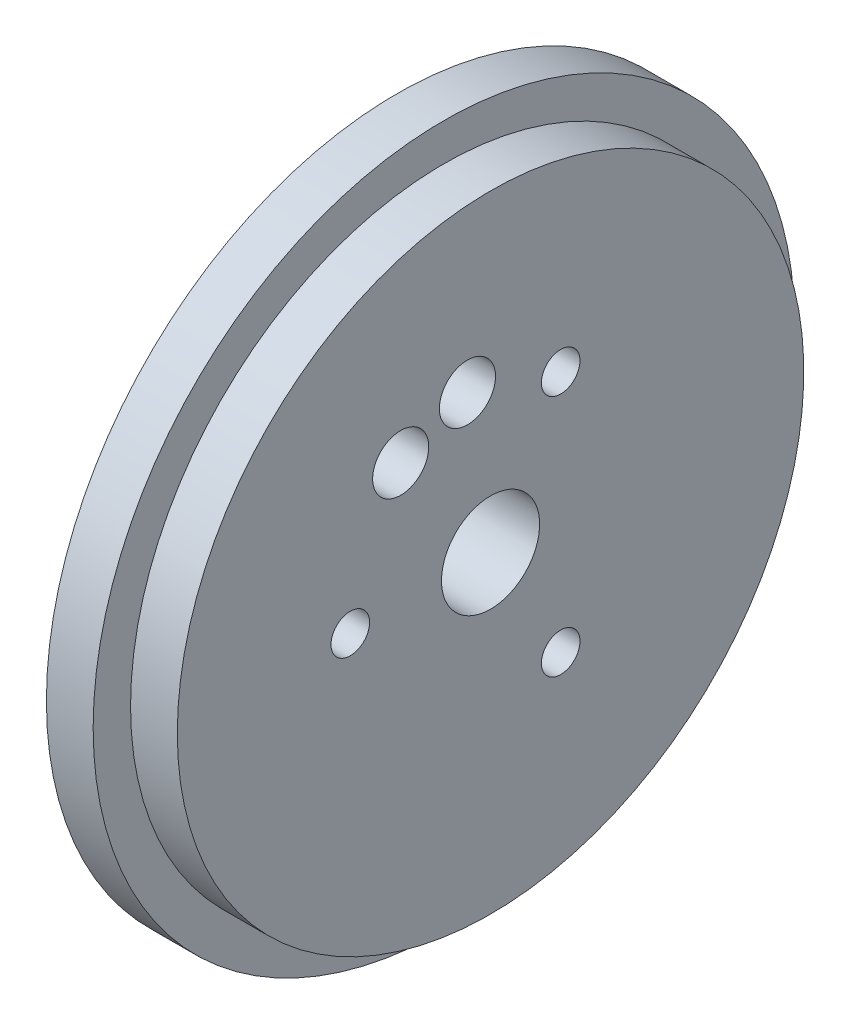
ISO-10303-21;
HEADER;
FILE_DESCRIPTION(('STEP AP214'),'2;1');
FILE_NAME('part.step','',(''),(''),'','','');
FILE_SCHEMA(('AUTOMOTIVE_DESIGN { 1 0 10303 214 1 1 1 1 }'));
ENDSEC;
DATA;
#1=APPLICATION_CONTEXT('core data for automotive mechanical design processes');
#2=APPLICATION_PROTOCOL_DEFINITION('international standard','automotive_design',2000,#1);
#3=PRODUCT_CONTEXT('',#1,'mechanical');
#4=PRODUCT('Part','Part','',(#3));
#5=PRODUCT_RELATED_PRODUCT_CATEGORY('part','',(#4));
#6=PRODUCT_DEFINITION_FORMATION('','',#4);
#7=PRODUCT_DEFINITION_CONTEXT('part definition',#1,'design');
#8=PRODUCT_DEFINITION('design','',#6,#7);
#9=PRODUCT_DEFINITION_SHAPE('','',#8);
#10=(LENGTH_UNIT() NAMED_UNIT(*) SI_UNIT(.MILLI.,.METRE.));
#11=(NAMED_UNIT(*) PLANE_ANGLE_UNIT() SI_UNIT($,.RADIAN.));
#12=(NAMED_UNIT(*) SI_UNIT($,.STERADIAN.) SOLID_ANGLE_UNIT());
#13=UNCERTAINTY_MEASURE_WITH_UNIT(LENGTH_MEASURE(1.E-05),#10,'distance_accuracy_value','');
#14=(GEOMETRIC_REPRESENTATION_CONTEXT(3) GLOBAL_UNCERTAINTY_ASSIGNED_CONTEXT((#13)) GLOBAL_UNIT_ASSIGNED_CONTEXT((#10,
#11,#12)) REPRESENTATION_CONTEXT('',''));
#15=CARTESIAN_POINT('',(0.,0.,0.));
#16=DIRECTION('',(0.,0.,1.));
#17=DIRECTION('',(1.,0.,0.));
#18=AXIS2_PLACEMENT_3D('',#15,#16,#17);
#19=CARTESIAN_POINT('',(135.7,30.,0.));
#20=DIRECTION('',(1.,0.,0.));
#21=DIRECTION('',(0.,0.,-1.));
#22=AXIS2_PLACEMENT_3D('',#19,#20,#21);
#23=PLANE('',#22);
#24=CARTESIAN_POINT('',(135.7,10.3923048454133,-6.00000000000001));
#25=DIRECTION('',(1.,0.,0.));
#26=DIRECTION('',(0.,0.,-1.));
#27=AXIS2_PLACEMENT_3D('',#24,#25,#26);
#28=CIRCLE('',#27,1.65);
#29=CARTESIAN_POINT('',(135.7,10.3923048454133,-7.65000000000001));
#30=VERTEX_POINT('',#29);
#31=EDGE_CURVE('E56',#30,#30,#28,.F.);
#32=ORIENTED_EDGE('',*,*,#31,.F.);
#33=EDGE_LOOP('',(#32));
#34=FACE_BOUND('',#33,.T.);
#35=CARTESIAN_POINT('',(135.7,-10.3923048454133,-6.));
#36=DIRECTION('',(1.,0.,0.));
#37=DIRECTION('',(0.,0.,-1.));
#38=AXIS2_PLACEMENT_3D('',#35,#36,#37);
#39=CIRCLE('',#38,1.65);
#40=CARTESIAN_POINT('',(135.7,-10.3923048454133,-7.65));
#41=VERTEX_POINT('',#40);
#42=EDGE_CURVE('E59',#41,#41,#39,.F.);
#43=ORIENTED_EDGE('',*,*,#42,.F.);
#44=EDGE_LOOP('',(#43));
#45=FACE_BOUND('',#44,.T.);
#46=CARTESIAN_POINT('',(135.7,0.,12.));
#47=DIRECTION('',(1.,0.,0.));
#48=DIRECTION('',(0.,0.,-1.));
#49=AXIS2_PLACEMENT_3D('',#46,#47,#48);
#50=CIRCLE('',#49,1.65);
#51=CARTESIAN_POINT('',(135.7,0.,10.35));
#52=VERTEX_POINT('',#51);
#53=EDGE_CURVE('E62',#52,#52,#50,.F.);
#54=ORIENTED_EDGE('',*,*,#53,.F.);
#55=EDGE_LOOP('',(#54));
#56=FACE_BOUND('',#55,.T.);
#57=CARTESIAN_POINT('',(135.7,10.4836474229945,7.68720604058077));
#58=DIRECTION('',(1.,0.,0.));
#59=DIRECTION('',(0.,0.,-1.));
#60=AXIS2_PLACEMENT_3D('',#57,#58,#59);
#61=CIRCLE('',#60,2.4);
#62=CARTESIAN_POINT('',(135.7,10.4836474229945,5.28720604058077));
#63=VERTEX_POINT('',#62);
#64=EDGE_CURVE('E65',#63,#63,#61,.F.);
#65=ORIENTED_EDGE('',*,*,#64,.F.);
#66=EDGE_LOOP('',(#65));
#67=FACE_BOUND('',#66,.T.);
#68=CARTESIAN_POINT('',(135.7,12.8487337040411,1.97738266469541));
#69=DIRECTION('',(1.,0.,0.));
#70=DIRECTION('',(0.,0.,-1.));
#71=AXIS2_PLACEMENT_3D('',#68,#69,#70);
#72=CIRCLE('',#71,2.4);
#73=CARTESIAN_POINT('',(135.7,12.8487337040411,-0.422617335304591));
#74=VERTEX_POINT('',#73);
#75=EDGE_CURVE('E68',#74,#74,#72,.F.);
#76=ORIENTED_EDGE('',*,*,#75,.F.);
#77=EDGE_LOOP('',(#76));
#78=FACE_BOUND('',#77,.T.);
#79=CARTESIAN_POINT('',(135.7,0.,0.));
#80=DIRECTION('',(-1.,0.,0.));
#81=DIRECTION('',(0.,0.,1.));
#82=AXIS2_PLACEMENT_3D('',#79,#80,#81);
#83=CIRCLE('',#82,4.2);
#84=CARTESIAN_POINT('',(135.7,0.,4.2));
#85=VERTEX_POINT('',#84);
#86=EDGE_CURVE('E10',#85,#85,#83,.T.);
#87=ORIENTED_EDGE('',*,*,#86,.F.);
#88=EDGE_LOOP('',(#87));
#89=FACE_BOUND('',#88,.T.);
#90=CARTESIAN_POINT('',(135.7,0.,0.));
#91=DIRECTION('',(-1.,0.,0.));
#92=DIRECTION('',(0.,0.,1.));
#93=AXIS2_PLACEMENT_3D('',#90,#91,#92);
#94=CIRCLE('',#93,30.);
#95=CARTESIAN_POINT('',(135.7,0.,30.));
#96=VERTEX_POINT('',#95);
#97=EDGE_CURVE('E53',#96,#96,#94,.T.);
#98=ORIENTED_EDGE('',*,*,#97,.T.);
#99=EDGE_LOOP('',(#98));
#100=FACE_BOUND('',#99,.T.);
#101=ADVANCED_FACE('F31',(#34,#45,#56,#67,#78,#89,#100),#23,.F.);
#102=CARTESIAN_POINT('',(-110.,0.,0.));
#103=DIRECTION('',(-1.,0.,0.));
#104=DIRECTION('',(0.,0.,1.));
#105=AXIS2_PLACEMENT_3D('',#102,#103,#104);
#106=CYLINDRICAL_SURFACE('',#105,4.2);
#107=CARTESIAN_POINT('',(143.7,0.,0.));
#108=DIRECTION('',(-1.,0.,0.));
#109=DIRECTION('',(0.,0.,1.));
#110=AXIS2_PLACEMENT_3D('',#107,#108,#109);
#111=CIRCLE('',#110,4.2);
#112=CARTESIAN_POINT('',(143.7,0.,4.2));
#113=VERTEX_POINT('',#112);
#114=EDGE_CURVE('E37',#113,#113,#111,.T.);
#115=ORIENTED_EDGE('',*,*,#114,.F.);
#116=EDGE_LOOP('',(#115));
#117=FACE_BOUND('',#116,.T.);
#118=ORIENTED_EDGE('',*,*,#86,.T.);
#119=EDGE_LOOP('',(#118));
#120=FACE_BOUND('',#119,.T.);
#121=ADVANCED_FACE('F94',(#117,#120),#106,.F.);
#122=CARTESIAN_POINT('',(143.7,4.2,0.));
#123=DIRECTION('',(-1.,0.,0.));
#124=DIRECTION('',(0.,0.,1.));
#125=AXIS2_PLACEMENT_3D('',#122,#123,#124);
#126=PLANE('',#125);
#127=CARTESIAN_POINT('',(143.7,10.3923048454133,-6.00000000000001));
#128=DIRECTION('',(1.,0.,0.));
#129=DIRECTION('',(0.,0.,-1.));
#130=AXIS2_PLACEMENT_3D('',#127,#128,#129);
#131=CIRCLE('',#130,1.65);
#132=CARTESIAN_POINT('',(143.7,10.3923048454133,-7.65000000000001));
#133=VERTEX_POINT('',#132);
#134=EDGE_CURVE('E75',#133,#133,#131,.T.);
#135=ORIENTED_EDGE('',*,*,#134,.F.);
#136=EDGE_LOOP('',(#135));
#137=FACE_BOUND('',#136,.T.);
#138=CARTESIAN_POINT('',(143.7,-10.3923048454133,-6.));
#139=DIRECTION('',(1.,0.,0.));
#140=DIRECTION('',(0.,0.,-1.));
#141=AXIS2_PLACEMENT_3D('',#138,#139,#140);
#142=CIRCLE('',#141,1.65);
#143=CARTESIAN_POINT('',(143.7,-10.3923048454133,-7.65));
#144=VERTEX_POINT('',#143);
#145=EDGE_CURVE('E78',#144,#144,#142,.T.);
#146=ORIENTED_EDGE('',*,*,#145,.F.);
#147=EDGE_LOOP('',(#146));
#148=FACE_BOUND('',#147,.T.);
#149=CARTESIAN_POINT('',(143.7,0.,12.));
#150=DIRECTION('',(1.,0.,0.));
#151=DIRECTION('',(0.,0.,-1.));
#152=AXIS2_PLACEMENT_3D('',#149,#150,#151);
#153=CIRCLE('',#152,1.65);
#154=CARTESIAN_POINT('',(143.7,0.,10.35));
#155=VERTEX_POINT('',#154);
#156=EDGE_CURVE('E81',#155,#155,#153,.T.);
#157=ORIENTED_EDGE('',*,*,#156,.F.);
#158=EDGE_LOOP('',(#157));
#159=FACE_BOUND('',#158,.T.);
#160=CARTESIAN_POINT('',(143.7,10.4836474229945,7.68720604058077));
#161=DIRECTION('',(1.,0.,0.));
#162=DIRECTION('',(0.,0.,-1.));
#163=AXIS2_PLACEMENT_3D('',#160,#161,#162);
#164=CIRCLE('',#163,2.4);
#165=CARTESIAN_POINT('',(143.7,10.4836474229945,5.28720604058077));
#166=VERTEX_POINT('',#165);
#167=EDGE_CURVE('E74',#166,#166,#164,.T.);
#168=ORIENTED_EDGE('',*,*,#167,.F.);
#169=EDGE_LOOP('',(#168));
#170=FACE_BOUND('',#169,.T.);
#171=CARTESIAN_POINT('',(143.7,12.8487337040411,1.97738266469541));
#172=DIRECTION('',(1.,0.,0.));
#173=DIRECTION('',(0.,0.,-1.));
#174=AXIS2_PLACEMENT_3D('',#171,#172,#173);
#175=CIRCLE('',#174,2.4);
#176=CARTESIAN_POINT('',(143.7,12.8487337040411,-0.422617335304591));
#177=VERTEX_POINT('',#176);
#178=EDGE_CURVE('E71',#177,#177,#175,.T.);
#179=ORIENTED_EDGE('',*,*,#178,.F.);
#180=EDGE_LOOP('',(#179));
#181=FACE_BOUND('',#180,.T.);
#182=CARTESIAN_POINT('',(143.7,0.,0.));
#183=DIRECTION('',(-1.,0.,0.));
#184=DIRECTION('',(0.,0.,1.));
#185=AXIS2_PLACEMENT_3D('',#182,#183,#184);
#186=CIRCLE('',#185,26.8);
#187=CARTESIAN_POINT('',(143.7,0.,26.8));
#188=VERTEX_POINT('',#187);
#189=EDGE_CURVE('E41',#188,#188,#186,.T.);
#190=ORIENTED_EDGE('',*,*,#189,.F.);
#191=EDGE_LOOP('',(#190));
#192=FACE_BOUND('',#191,.T.);
#193=ORIENTED_EDGE('',*,*,#114,.T.);
#194=EDGE_LOOP('',(#193));
#195=FACE_BOUND('',#194,.T.);
#196=ADVANCED_FACE('F90',(#137,#148,#159,#170,#181,#192,#195),#126,.F.);
#197=CARTESIAN_POINT('',(-110.,0.,0.));
#198=DIRECTION('',(-1.,0.,0.));
#199=DIRECTION('',(0.,0.,1.));
#200=AXIS2_PLACEMENT_3D('',#197,#198,#199);
#201=CYLINDRICAL_SURFACE('',#200,26.8);
#202=CARTESIAN_POINT('',(139.7,0.,0.));
#203=DIRECTION('',(-1.,0.,0.));
#204=DIRECTION('',(0.,0.,1.));
#205=AXIS2_PLACEMENT_3D('',#202,#203,#204);
#206=CIRCLE('',#205,26.8);
#207=CARTESIAN_POINT('',(139.7,0.,26.8));
#208=VERTEX_POINT('',#207);
#209=EDGE_CURVE('E45',#208,#208,#206,.T.);
#210=ORIENTED_EDGE('',*,*,#209,.F.);
#211=EDGE_LOOP('',(#210));
#212=FACE_BOUND('',#211,.T.);
#213=ORIENTED_EDGE('',*,*,#189,.T.);
#214=EDGE_LOOP('',(#213));
#215=FACE_BOUND('',#214,.T.);
#216=ADVANCED_FACE('F93',(#212,#215),#201,.T.);
#217=CARTESIAN_POINT('',(139.7,26.8,0.));
#218=DIRECTION('',(-1.,0.,0.));
#219=DIRECTION('',(0.,0.,1.));
#220=AXIS2_PLACEMENT_3D('',#217,#218,#219);
#221=PLANE('',#220);
#222=CARTESIAN_POINT('',(139.7,0.,0.));
#223=DIRECTION('',(-1.,0.,0.));
#224=DIRECTION('',(0.,0.,1.));
#225=AXIS2_PLACEMENT_3D('',#222,#223,#224);
#226=CIRCLE('',#225,30.);
#227=CARTESIAN_POINT('',(139.7,0.,30.));
#228=VERTEX_POINT('',#227);
#229=EDGE_CURVE('E50',#228,#228,#226,.T.);
#230=ORIENTED_EDGE('',*,*,#229,.F.);
#231=EDGE_LOOP('',(#230));
#232=FACE_BOUND('',#231,.T.);
#233=ORIENTED_EDGE('',*,*,#209,.T.);
#234=EDGE_LOOP('',(#233));
#235=FACE_BOUND('',#234,.T.);
#236=ADVANCED_FACE('F102',(#232,#235),#221,.F.);
#237=CARTESIAN_POINT('',(-110.,0.,0.));
#238=DIRECTION('',(-1.,0.,0.));
#239=DIRECTION('',(0.,0.,1.));
#240=AXIS2_PLACEMENT_3D('',#237,#238,#239);
#241=CYLINDRICAL_SURFACE('',#240,30.);
#242=ORIENTED_EDGE('',*,*,#97,.F.);
#243=EDGE_LOOP('',(#242));
#244=FACE_BOUND('',#243,.T.);
#245=ORIENTED_EDGE('',*,*,#229,.T.);
#246=EDGE_LOOP('',(#245));
#247=FACE_BOUND('',#246,.T.);
#248=ADVANCED_FACE('F108',(#244,#247),#241,.T.);
#249=CARTESIAN_POINT('',(143.7,12.8487337040411,1.97738266469541));
#250=DIRECTION('',(-1.,0.,0.));
#251=DIRECTION('',(0.,0.,1.));
#252=AXIS2_PLACEMENT_3D('',#249,#250,#251);
#253=CYLINDRICAL_SURFACE('',#252,2.4);
#254=ORIENTED_EDGE('',*,*,#178,.T.);
#255=EDGE_LOOP('',(#254));
#256=FACE_BOUND('',#255,.T.);
#257=ORIENTED_EDGE('',*,*,#75,.T.);
#258=EDGE_LOOP('',(#257));
#259=FACE_BOUND('',#258,.T.);
#260=ADVANCED_FACE('F133',(#256,#259),#253,.F.);
#261=CARTESIAN_POINT('',(143.7,10.4836474229945,7.68720604058077));
#262=DIRECTION('',(-1.,0.,0.));
#263=DIRECTION('',(0.,0.,1.));
#264=AXIS2_PLACEMENT_3D('',#261,#262,#263);
#265=CYLINDRICAL_SURFACE('',#264,2.4);
#266=ORIENTED_EDGE('',*,*,#167,.T.);
#267=EDGE_LOOP('',(#266));
#268=FACE_BOUND('',#267,.T.);
#269=ORIENTED_EDGE('',*,*,#64,.T.);
#270=EDGE_LOOP('',(#269));
#271=FACE_BOUND('',#270,.T.);
#272=ADVANCED_FACE('F87',(#268,#271),#265,.F.);
#273=CARTESIAN_POINT('',(143.7,0.,12.));
#274=DIRECTION('',(-1.,0.,0.));
#275=DIRECTION('',(0.,0.,1.));
#276=AXIS2_PLACEMENT_3D('',#273,#274,#275);
#277=CYLINDRICAL_SURFACE('',#276,1.65);
#278=ORIENTED_EDGE('',*,*,#156,.T.);
#279=EDGE_LOOP('',(#278));
#280=FACE_BOUND('',#279,.T.);
#281=ORIENTED_EDGE('',*,*,#53,.T.);
#282=EDGE_LOOP('',(#281));
#283=FACE_BOUND('',#282,.T.);
#284=ADVANCED_FACE('F150',(#280,#283),#277,.F.);
#285=CARTESIAN_POINT('',(143.7,-10.3923048454133,-6.));
#286=DIRECTION('',(-1.,0.,0.));
#287=DIRECTION('',(0.,0.,1.));
#288=AXIS2_PLACEMENT_3D('',#285,#286,#287);
#289=CYLINDRICAL_SURFACE('',#288,1.65);
#290=ORIENTED_EDGE('',*,*,#145,.T.);
#291=EDGE_LOOP('',(#290));
#292=FACE_BOUND('',#291,.T.);
#293=ORIENTED_EDGE('',*,*,#42,.T.);
#294=EDGE_LOOP('',(#293));
#295=FACE_BOUND('',#294,.T.);
#296=ADVANCED_FACE('F146',(#292,#295),#289,.F.);
#297=CARTESIAN_POINT('',(143.7,10.3923048454133,-6.00000000000001));
#298=DIRECTION('',(-1.,0.,0.));
#299=DIRECTION('',(0.,0.,1.));
#300=AXIS2_PLACEMENT_3D('',#297,#298,#299);
#301=CYLINDRICAL_SURFACE('',#300,1.65);
#302=ORIENTED_EDGE('',*,*,#134,.T.);
#303=EDGE_LOOP('',(#302));
#304=FACE_BOUND('',#303,.T.);
#305=ORIENTED_EDGE('',*,*,#31,.T.);
#306=EDGE_LOOP('',(#305));
#307=FACE_BOUND('',#306,.T.);
#308=ADVANCED_FACE('F143',(#304,#307),#301,.F.);
#309=CLOSED_SHELL('',(#101,#121,#196,#216,#236,#248,#260,#272,#284,#296,#308));
#310=MANIFOLD_SOLID_BREP('B2',#309);
#311=ADVANCED_BREP_SHAPE_REPRESENTATION('',(#18,#310),#14);
#312=SHAPE_DEFINITION_REPRESENTATION(#9,#311);
ENDSEC;
END-ISO-10303-21;
